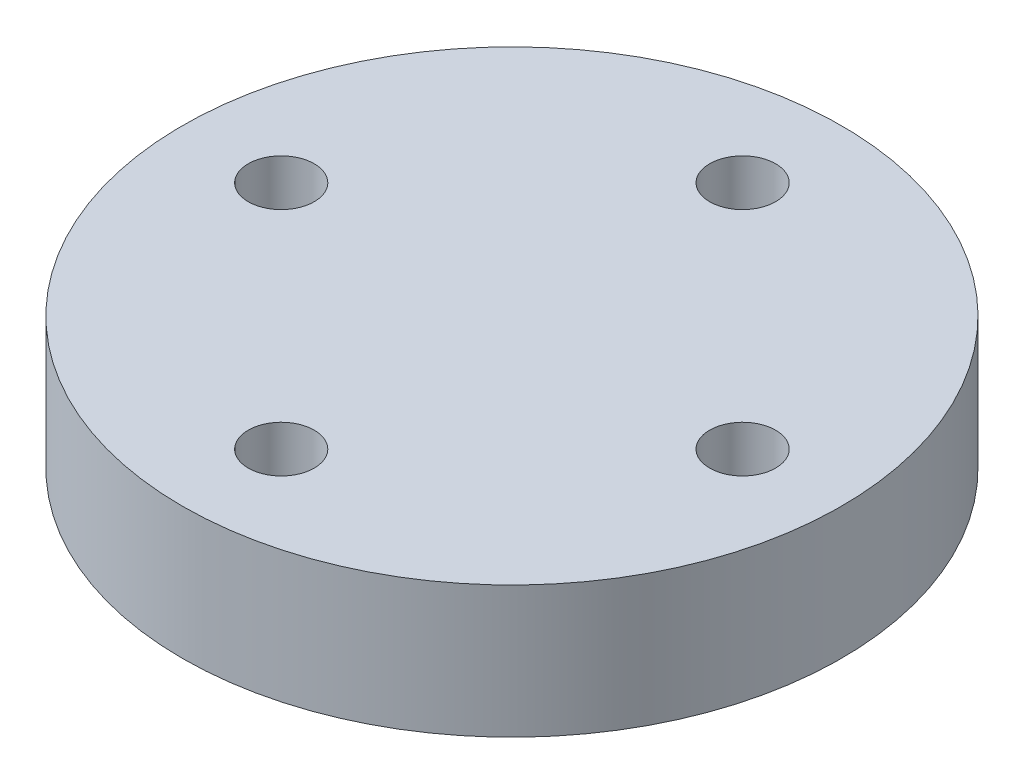
ISO-10303-21;
HEADER;
FILE_DESCRIPTION(('STEP AP214'),'2;1');
FILE_NAME('part.step','',(''),(''),'','','');
FILE_SCHEMA(('AUTOMOTIVE_DESIGN { 1 0 10303 214 1 1 1 1 }'));
ENDSEC;
DATA;
#1=APPLICATION_CONTEXT('core data for automotive mechanical design processes');
#2=APPLICATION_PROTOCOL_DEFINITION('international standard','automotive_design',2000,#1);
#3=PRODUCT_CONTEXT('',#1,'mechanical');
#4=PRODUCT('Part','Part','',(#3));
#5=PRODUCT_RELATED_PRODUCT_CATEGORY('part','',(#4));
#6=PRODUCT_DEFINITION_FORMATION('','',#4);
#7=PRODUCT_DEFINITION_CONTEXT('part definition',#1,'design');
#8=PRODUCT_DEFINITION('design','',#6,#7);
#9=PRODUCT_DEFINITION_SHAPE('','',#8);
#10=(LENGTH_UNIT() NAMED_UNIT(*) SI_UNIT(.MILLI.,.METRE.));
#11=(NAMED_UNIT(*) PLANE_ANGLE_UNIT() SI_UNIT($,.RADIAN.));
#12=(NAMED_UNIT(*) SI_UNIT($,.STERADIAN.) SOLID_ANGLE_UNIT());
#13=UNCERTAINTY_MEASURE_WITH_UNIT(LENGTH_MEASURE(1.E-05),#10,'distance_accuracy_value','');
#14=(GEOMETRIC_REPRESENTATION_CONTEXT(3) GLOBAL_UNCERTAINTY_ASSIGNED_CONTEXT((#13)) GLOBAL_UNIT_ASSIGNED_CONTEXT((#10,
#11,#12)) REPRESENTATION_CONTEXT('',''));
#15=CARTESIAN_POINT('',(0.,0.,0.));
#16=DIRECTION('',(0.,0.,1.));
#17=DIRECTION('',(1.,0.,0.));
#18=AXIS2_PLACEMENT_3D('',#15,#16,#17);
#19=CARTESIAN_POINT('',(0.,4.,0.));
#20=DIRECTION('',(0.,1.,0.));
#21=DIRECTION('',(0.,0.,1.));
#22=AXIS2_PLACEMENT_3D('',#19,#20,#21);
#23=PLANE('',#22);
#24=CARTESIAN_POINT('',(0.,4.,7.));
#25=DIRECTION('',(0.,1.,0.));
#26=DIRECTION('',(0.,0.,1.));
#27=AXIS2_PLACEMENT_3D('',#24,#25,#26);
#28=CIRCLE('',#27,1.);
#29=CARTESIAN_POINT('',(0.,4.,8.));
#30=VERTEX_POINT('',#29);
#31=EDGE_CURVE('E55',#30,#30,#28,.T.);
#32=ORIENTED_EDGE('',*,*,#31,.F.);
#33=EDGE_LOOP('',(#32));
#34=FACE_BOUND('',#33,.T.);
#35=CARTESIAN_POINT('',(0.,4.,-7.));
#36=DIRECTION('',(0.,1.,0.));
#37=DIRECTION('',(0.,0.,1.));
#38=AXIS2_PLACEMENT_3D('',#35,#36,#37);
#39=CIRCLE('',#38,1.);
#40=CARTESIAN_POINT('',(0.,4.,-6.));
#41=VERTEX_POINT('',#40);
#42=EDGE_CURVE('E44',#41,#41,#39,.T.);
#43=ORIENTED_EDGE('',*,*,#42,.F.);
#44=EDGE_LOOP('',(#43));
#45=FACE_BOUND('',#44,.T.);
#46=CARTESIAN_POINT('',(0.,4.,0.));
#47=DIRECTION('',(0.,1.,0.));
#48=DIRECTION('',(0.,0.,1.));
#49=AXIS2_PLACEMENT_3D('',#46,#47,#48);
#50=CIRCLE('',#49,10.);
#51=CARTESIAN_POINT('',(0.,4.,10.));
#52=VERTEX_POINT('',#51);
#53=EDGE_CURVE('E10',#52,#52,#50,.T.);
#54=ORIENTED_EDGE('',*,*,#53,.T.);
#55=EDGE_LOOP('',(#54));
#56=FACE_BOUND('',#55,.T.);
#57=CARTESIAN_POINT('',(7.,4.,0.));
#58=DIRECTION('',(0.,1.,0.));
#59=DIRECTION('',(0.,0.,1.));
#60=AXIS2_PLACEMENT_3D('',#57,#58,#59);
#61=CIRCLE('',#60,1.);
#62=CARTESIAN_POINT('',(7.,4.,1.));
#63=VERTEX_POINT('',#62);
#64=EDGE_CURVE('E49',#63,#63,#61,.T.);
#65=ORIENTED_EDGE('',*,*,#64,.F.);
#66=EDGE_LOOP('',(#65));
#67=FACE_BOUND('',#66,.T.);
#68=CARTESIAN_POINT('',(-7.,4.,0.));
#69=DIRECTION('',(0.,1.,0.));
#70=DIRECTION('',(0.,0.,1.));
#71=AXIS2_PLACEMENT_3D('',#68,#69,#70);
#72=CIRCLE('',#71,1.);
#73=CARTESIAN_POINT('',(-7.,4.,1.));
#74=VERTEX_POINT('',#73);
#75=EDGE_CURVE('E61',#74,#74,#72,.T.);
#76=ORIENTED_EDGE('',*,*,#75,.F.);
#77=EDGE_LOOP('',(#76));
#78=FACE_BOUND('',#77,.T.);
#79=ADVANCED_FACE('F33',(#34,#45,#56,#67,#78),#23,.T.);
#80=CARTESIAN_POINT('',(0.,0.,0.));
#81=DIRECTION('',(0.,1.,0.));
#82=DIRECTION('',(0.,0.,1.));
#83=AXIS2_PLACEMENT_3D('',#80,#81,#82);
#84=PLANE('',#83);
#85=CARTESIAN_POINT('',(0.,0.,0.));
#86=DIRECTION('',(0.,1.,0.));
#87=DIRECTION('',(0.,0.,1.));
#88=AXIS2_PLACEMENT_3D('',#85,#86,#87);
#89=CIRCLE('',#88,10.);
#90=CARTESIAN_POINT('',(0.,0.,10.));
#91=VERTEX_POINT('',#90);
#92=EDGE_CURVE('E37',#91,#91,#89,.T.);
#93=ORIENTED_EDGE('',*,*,#92,.F.);
#94=EDGE_LOOP('',(#93));
#95=FACE_BOUND('',#94,.T.);
#96=CARTESIAN_POINT('',(0.,0.,-7.));
#97=DIRECTION('',(0.,1.,0.));
#98=DIRECTION('',(0.,0.,1.));
#99=AXIS2_PLACEMENT_3D('',#96,#97,#98);
#100=CIRCLE('',#99,1.);
#101=CARTESIAN_POINT('',(0.,0.,-6.));
#102=VERTEX_POINT('',#101);
#103=EDGE_CURVE('E46',#102,#102,#100,.T.);
#104=ORIENTED_EDGE('',*,*,#103,.T.);
#105=EDGE_LOOP('',(#104));
#106=FACE_BOUND('',#105,.T.);
#107=CARTESIAN_POINT('',(7.,0.,0.));
#108=DIRECTION('',(0.,1.,0.));
#109=DIRECTION('',(0.,0.,1.));
#110=AXIS2_PLACEMENT_3D('',#107,#108,#109);
#111=CIRCLE('',#110,1.);
#112=CARTESIAN_POINT('',(7.,0.,1.));
#113=VERTEX_POINT('',#112);
#114=EDGE_CURVE('E52',#113,#113,#111,.T.);
#115=ORIENTED_EDGE('',*,*,#114,.T.);
#116=EDGE_LOOP('',(#115));
#117=FACE_BOUND('',#116,.T.);
#118=CARTESIAN_POINT('',(0.,0.,7.));
#119=DIRECTION('',(0.,1.,0.));
#120=DIRECTION('',(0.,0.,1.));
#121=AXIS2_PLACEMENT_3D('',#118,#119,#120);
#122=CIRCLE('',#121,1.);
#123=CARTESIAN_POINT('',(0.,0.,8.));
#124=VERTEX_POINT('',#123);
#125=EDGE_CURVE('E58',#124,#124,#122,.T.);
#126=ORIENTED_EDGE('',*,*,#125,.T.);
#127=EDGE_LOOP('',(#126));
#128=FACE_BOUND('',#127,.T.);
#129=CARTESIAN_POINT('',(-7.,0.,0.));
#130=DIRECTION('',(0.,1.,0.));
#131=DIRECTION('',(0.,0.,1.));
#132=AXIS2_PLACEMENT_3D('',#129,#130,#131);
#133=CIRCLE('',#132,1.);
#134=CARTESIAN_POINT('',(-7.,0.,1.));
#135=VERTEX_POINT('',#134);
#136=EDGE_CURVE('E64',#135,#135,#133,.T.);
#137=ORIENTED_EDGE('',*,*,#136,.T.);
#138=EDGE_LOOP('',(#137));
#139=FACE_BOUND('',#138,.T.);
#140=ADVANCED_FACE('F74',(#95,#106,#117,#128,#139),#84,.F.);
#141=CARTESIAN_POINT('',(0.,4.,0.));
#142=DIRECTION('',(0.,-1.,0.));
#143=DIRECTION('',(0.,0.,-1.));
#144=AXIS2_PLACEMENT_3D('',#141,#142,#143);
#145=CYLINDRICAL_SURFACE('',#144,10.);
#146=ORIENTED_EDGE('',*,*,#53,.F.);
#147=EDGE_LOOP('',(#146));
#148=FACE_BOUND('',#147,.T.);
#149=ORIENTED_EDGE('',*,*,#92,.T.);
#150=EDGE_LOOP('',(#149));
#151=FACE_BOUND('',#150,.T.);
#152=ADVANCED_FACE('F35',(#148,#151),#145,.T.);
#153=CARTESIAN_POINT('',(0.,4.,-7.));
#154=DIRECTION('',(0.,-1.,0.));
#155=DIRECTION('',(0.,0.,-1.));
#156=AXIS2_PLACEMENT_3D('',#153,#154,#155);
#157=CYLINDRICAL_SURFACE('',#156,1.);
#158=ORIENTED_EDGE('',*,*,#42,.T.);
#159=EDGE_LOOP('',(#158));
#160=FACE_BOUND('',#159,.T.);
#161=ORIENTED_EDGE('',*,*,#103,.F.);
#162=EDGE_LOOP('',(#161));
#163=FACE_BOUND('',#162,.T.);
#164=ADVANCED_FACE('F84',(#160,#163),#157,.F.);
#165=CARTESIAN_POINT('',(7.,4.,0.));
#166=DIRECTION('',(0.,-1.,0.));
#167=DIRECTION('',(0.,0.,-1.));
#168=AXIS2_PLACEMENT_3D('',#165,#166,#167);
#169=CYLINDRICAL_SURFACE('',#168,1.);
#170=ORIENTED_EDGE('',*,*,#64,.T.);
#171=EDGE_LOOP('',(#170));
#172=FACE_BOUND('',#171,.T.);
#173=ORIENTED_EDGE('',*,*,#114,.F.);
#174=EDGE_LOOP('',(#173));
#175=FACE_BOUND('',#174,.T.);
#176=ADVANCED_FACE('F87',(#172,#175),#169,.F.);
#177=CARTESIAN_POINT('',(0.,4.,7.));
#178=DIRECTION('',(0.,-1.,0.));
#179=DIRECTION('',(0.,0.,-1.));
#180=AXIS2_PLACEMENT_3D('',#177,#178,#179);
#181=CYLINDRICAL_SURFACE('',#180,1.);
#182=ORIENTED_EDGE('',*,*,#31,.T.);
#183=EDGE_LOOP('',(#182));
#184=FACE_BOUND('',#183,.T.);
#185=ORIENTED_EDGE('',*,*,#125,.F.);
#186=EDGE_LOOP('',(#185));
#187=FACE_BOUND('',#186,.T.);
#188=ADVANCED_FACE('F91',(#184,#187),#181,.F.);
#189=CARTESIAN_POINT('',(-7.,4.,0.));
#190=DIRECTION('',(0.,-1.,0.));
#191=DIRECTION('',(0.,0.,-1.));
#192=AXIS2_PLACEMENT_3D('',#189,#190,#191);
#193=CYLINDRICAL_SURFACE('',#192,1.);
#194=ORIENTED_EDGE('',*,*,#75,.T.);
#195=EDGE_LOOP('',(#194));
#196=FACE_BOUND('',#195,.T.);
#197=ORIENTED_EDGE('',*,*,#136,.F.);
#198=EDGE_LOOP('',(#197));
#199=FACE_BOUND('',#198,.T.);
#200=ADVANCED_FACE('F70',(#196,#199),#193,.F.);
#201=CLOSED_SHELL('',(#79,#140,#152,#164,#176,#188,#200));
#202=MANIFOLD_SOLID_BREP('B2',#201);
#203=ADVANCED_BREP_SHAPE_REPRESENTATION('',(#18,#202),#14);
#204=SHAPE_DEFINITION_REPRESENTATION(#9,#203);
ENDSEC;
END-ISO-10303-21;
